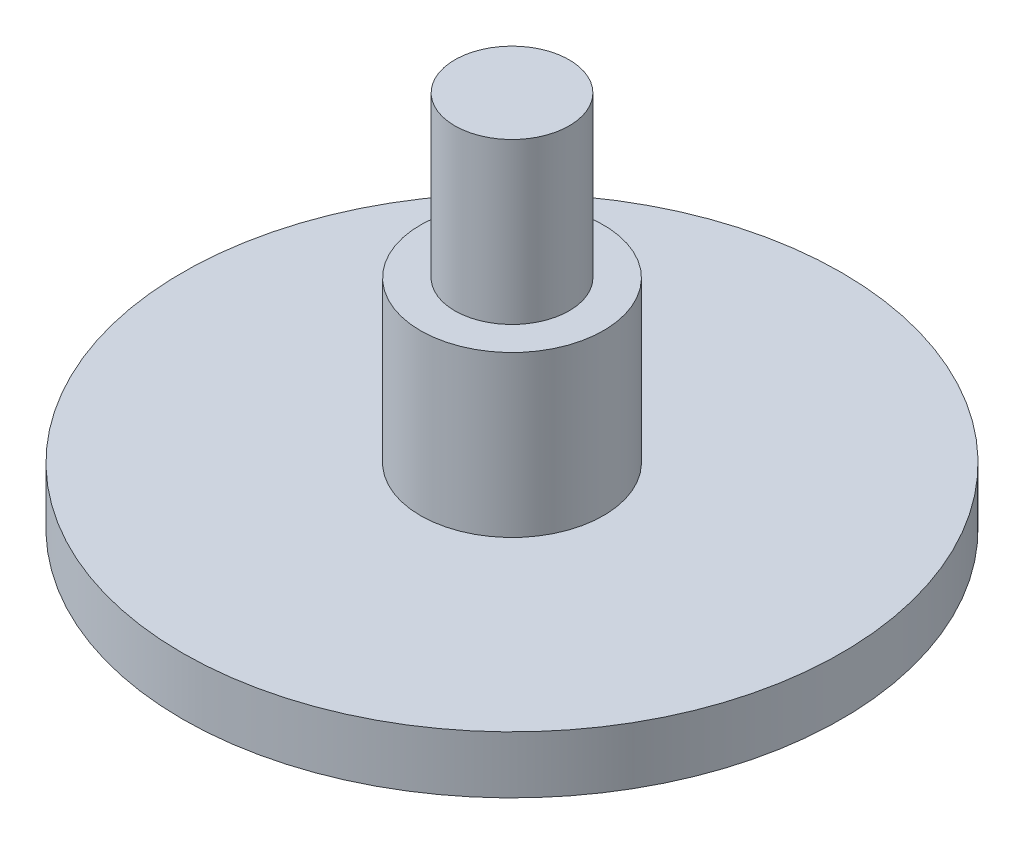
ISO-10303-21;
HEADER;
FILE_DESCRIPTION(('STEP AP214'),'2;1');
FILE_NAME('part.step','',(''),(''),'','','');
FILE_SCHEMA(('AUTOMOTIVE_DESIGN { 1 0 10303 214 1 1 1 1 }'));
ENDSEC;
DATA;
#1=APPLICATION_CONTEXT('core data for automotive mechanical design processes');
#2=APPLICATION_PROTOCOL_DEFINITION('international standard','automotive_design',2000,#1);
#3=PRODUCT_CONTEXT('',#1,'mechanical');
#4=PRODUCT('Part','Part','',(#3));
#5=PRODUCT_RELATED_PRODUCT_CATEGORY('part','',(#4));
#6=PRODUCT_DEFINITION_FORMATION('','',#4);
#7=PRODUCT_DEFINITION_CONTEXT('part definition',#1,'design');
#8=PRODUCT_DEFINITION('design','',#6,#7);
#9=PRODUCT_DEFINITION_SHAPE('','',#8);
#10=(LENGTH_UNIT() NAMED_UNIT(*) SI_UNIT(.MILLI.,.METRE.));
#11=(NAMED_UNIT(*) PLANE_ANGLE_UNIT() SI_UNIT($,.RADIAN.));
#12=(NAMED_UNIT(*) SI_UNIT($,.STERADIAN.) SOLID_ANGLE_UNIT());
#13=UNCERTAINTY_MEASURE_WITH_UNIT(LENGTH_MEASURE(1.E-05),#10,'distance_accuracy_value','');
#14=(GEOMETRIC_REPRESENTATION_CONTEXT(3) GLOBAL_UNCERTAINTY_ASSIGNED_CONTEXT((#13)) GLOBAL_UNIT_ASSIGNED_CONTEXT((#10,
#11,#12)) REPRESENTATION_CONTEXT('',''));
#15=CARTESIAN_POINT('',(0.,0.,0.));
#16=DIRECTION('',(0.,0.,1.));
#17=DIRECTION('',(1.,0.,0.));
#18=AXIS2_PLACEMENT_3D('',#15,#16,#17);
#19=CARTESIAN_POINT('',(0.,5.,0.));
#20=DIRECTION('',(0.,-1.,0.));
#21=DIRECTION('',(0.,0.,-1.));
#22=AXIS2_PLACEMENT_3D('',#19,#20,#21);
#23=CYLINDRICAL_SURFACE('',#22,28.8);
#24=CARTESIAN_POINT('',(0.,5.,0.));
#25=DIRECTION('',(0.,1.,0.));
#26=DIRECTION('',(0.,0.,1.));
#27=AXIS2_PLACEMENT_3D('',#24,#25,#26);
#28=CIRCLE('',#27,28.8);
#29=CARTESIAN_POINT('',(0.,5.,28.8));
#30=VERTEX_POINT('',#29);
#31=EDGE_CURVE('E10',#30,#30,#28,.T.);
#32=ORIENTED_EDGE('',*,*,#31,.F.);
#33=EDGE_LOOP('',(#32));
#34=FACE_BOUND('',#33,.T.);
#35=CARTESIAN_POINT('',(0.,0.,0.));
#36=DIRECTION('',(0.,1.,0.));
#37=DIRECTION('',(0.,0.,1.));
#38=AXIS2_PLACEMENT_3D('',#35,#36,#37);
#39=CIRCLE('',#38,28.8);
#40=CARTESIAN_POINT('',(0.,0.,28.8));
#41=VERTEX_POINT('',#40);
#42=EDGE_CURVE('E34',#41,#41,#39,.T.);
#43=ORIENTED_EDGE('',*,*,#42,.T.);
#44=EDGE_LOOP('',(#43));
#45=FACE_BOUND('',#44,.T.);
#46=ADVANCED_FACE('F31',(#34,#45),#23,.T.);
#47=CARTESIAN_POINT('',(0.,5.,0.));
#48=DIRECTION('',(0.,1.,0.));
#49=DIRECTION('',(0.,0.,1.));
#50=AXIS2_PLACEMENT_3D('',#47,#48,#49);
#51=PLANE('',#50);
#52=CARTESIAN_POINT('',(0.,5.,0.));
#53=DIRECTION('',(0.,1.,0.));
#54=DIRECTION('',(0.,0.,1.));
#55=AXIS2_PLACEMENT_3D('',#52,#53,#54);
#56=CIRCLE('',#55,8.);
#57=CARTESIAN_POINT('',(0.,5.,8.));
#58=VERTEX_POINT('',#57);
#59=EDGE_CURVE('E43',#58,#58,#56,.T.);
#60=ORIENTED_EDGE('',*,*,#59,.F.);
#61=EDGE_LOOP('',(#60));
#62=FACE_BOUND('',#61,.T.);
#63=ORIENTED_EDGE('',*,*,#31,.T.);
#64=EDGE_LOOP('',(#63));
#65=FACE_BOUND('',#64,.T.);
#66=ADVANCED_FACE('F76',(#62,#65),#51,.T.);
#67=CARTESIAN_POINT('',(0.,0.,0.));
#68=DIRECTION('',(0.,1.,0.));
#69=DIRECTION('',(0.,0.,1.));
#70=AXIS2_PLACEMENT_3D('',#67,#68,#69);
#71=PLANE('',#70);
#72=ORIENTED_EDGE('',*,*,#42,.F.);
#73=EDGE_LOOP('',(#72));
#74=FACE_BOUND('',#73,.T.);
#75=ADVANCED_FACE('F72',(#74),#71,.F.);
#76=CARTESIAN_POINT('',(0.,19.,0.));
#77=DIRECTION('',(0.,-1.,0.));
#78=DIRECTION('',(0.,0.,-1.));
#79=AXIS2_PLACEMENT_3D('',#76,#77,#78);
#80=CYLINDRICAL_SURFACE('',#79,8.);
#81=CARTESIAN_POINT('',(0.,19.,0.));
#82=DIRECTION('',(0.,1.,0.));
#83=DIRECTION('',(0.,0.,1.));
#84=AXIS2_PLACEMENT_3D('',#81,#82,#83);
#85=CIRCLE('',#84,8.);
#86=CARTESIAN_POINT('',(0.,19.,8.));
#87=VERTEX_POINT('',#86);
#88=EDGE_CURVE('E41',#87,#87,#85,.T.);
#89=ORIENTED_EDGE('',*,*,#88,.F.);
#90=EDGE_LOOP('',(#89));
#91=FACE_BOUND('',#90,.T.);
#92=ORIENTED_EDGE('',*,*,#59,.T.);
#93=EDGE_LOOP('',(#92));
#94=FACE_BOUND('',#93,.T.);
#95=ADVANCED_FACE('F66',(#91,#94),#80,.T.);
#96=CARTESIAN_POINT('',(0.,19.,0.));
#97=DIRECTION('',(0.,1.,0.));
#98=DIRECTION('',(0.,0.,1.));
#99=AXIS2_PLACEMENT_3D('',#96,#97,#98);
#100=PLANE('',#99);
#101=CARTESIAN_POINT('',(0.,19.,0.));
#102=DIRECTION('',(0.,1.,0.));
#103=DIRECTION('',(0.,0.,1.));
#104=AXIS2_PLACEMENT_3D('',#101,#102,#103);
#105=CIRCLE('',#104,5.);
#106=CARTESIAN_POINT('',(0.,19.,5.));
#107=VERTEX_POINT('',#106);
#108=EDGE_CURVE('E49',#107,#107,#105,.T.);
#109=ORIENTED_EDGE('',*,*,#108,.F.);
#110=EDGE_LOOP('',(#109));
#111=FACE_BOUND('',#110,.T.);
#112=ORIENTED_EDGE('',*,*,#88,.T.);
#113=EDGE_LOOP('',(#112));
#114=FACE_BOUND('',#113,.T.);
#115=ADVANCED_FACE('F60',(#111,#114),#100,.T.);
#116=CARTESIAN_POINT('',(0.,33.,0.));
#117=DIRECTION('',(0.,-1.,0.));
#118=DIRECTION('',(0.,0.,-1.));
#119=AXIS2_PLACEMENT_3D('',#116,#117,#118);
#120=CYLINDRICAL_SURFACE('',#119,5.);
#121=CARTESIAN_POINT('',(0.,33.,0.));
#122=DIRECTION('',(0.,1.,0.));
#123=DIRECTION('',(0.,0.,1.));
#124=AXIS2_PLACEMENT_3D('',#121,#122,#123);
#125=CIRCLE('',#124,5.);
#126=CARTESIAN_POINT('',(0.,33.,5.));
#127=VERTEX_POINT('',#126);
#128=EDGE_CURVE('E46',#127,#127,#125,.T.);
#129=ORIENTED_EDGE('',*,*,#128,.F.);
#130=EDGE_LOOP('',(#129));
#131=FACE_BOUND('',#130,.T.);
#132=ORIENTED_EDGE('',*,*,#108,.T.);
#133=EDGE_LOOP('',(#132));
#134=FACE_BOUND('',#133,.T.);
#135=ADVANCED_FACE('F57',(#131,#134),#120,.T.);
#136=CARTESIAN_POINT('',(0.,33.,0.));
#137=DIRECTION('',(0.,1.,0.));
#138=DIRECTION('',(0.,0.,1.));
#139=AXIS2_PLACEMENT_3D('',#136,#137,#138);
#140=PLANE('',#139);
#141=ORIENTED_EDGE('',*,*,#128,.T.);
#142=EDGE_LOOP('',(#141));
#143=FACE_BOUND('',#142,.T.);
#144=ADVANCED_FACE('F55',(#143),#140,.T.);
#145=CLOSED_SHELL('',(#46,#66,#75,#95,#115,#135,#144));
#146=MANIFOLD_SOLID_BREP('B2',#145);
#147=ADVANCED_BREP_SHAPE_REPRESENTATION('',(#18,#146),#14);
#148=SHAPE_DEFINITION_REPRESENTATION(#9,#147);
ENDSEC;
END-ISO-10303-21;
